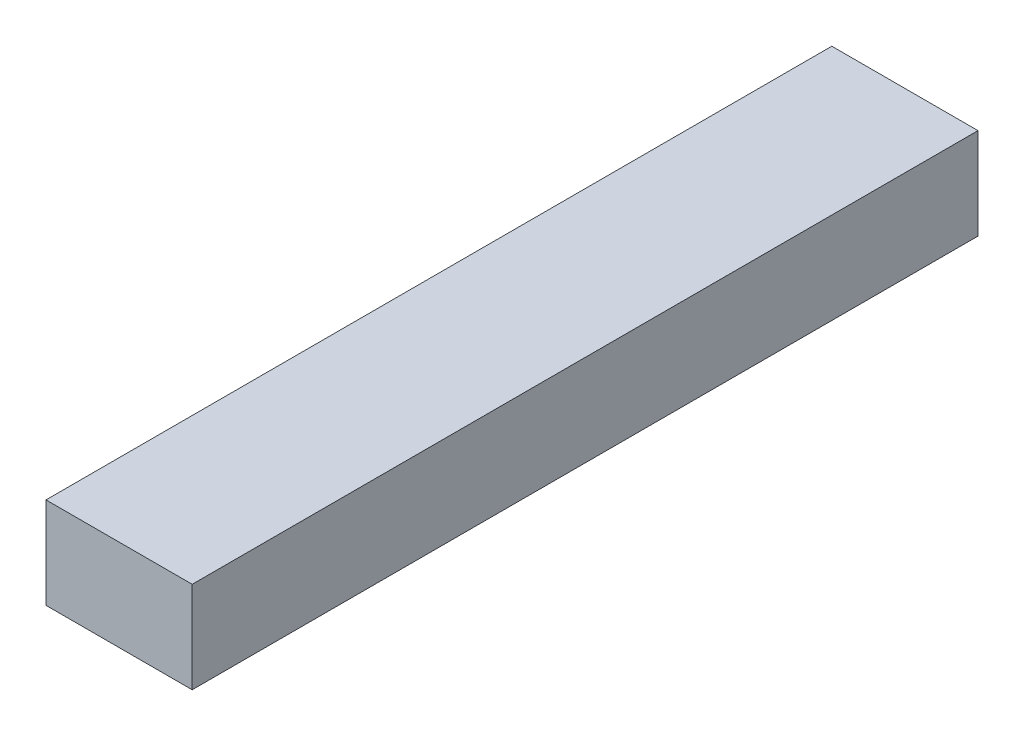
ISO-10303-21;
HEADER;
FILE_DESCRIPTION(('STEP AP214'),'2;1');
FILE_NAME('part.step','',(''),(''),'','','');
FILE_SCHEMA(('AUTOMOTIVE_DESIGN { 1 0 10303 214 1 1 1 1 }'));
ENDSEC;
DATA;
#1=APPLICATION_CONTEXT('core data for automotive mechanical design processes');
#2=APPLICATION_PROTOCOL_DEFINITION('international standard','automotive_design',2000,#1);
#3=PRODUCT_CONTEXT('',#1,'mechanical');
#4=PRODUCT('Part','Part','',(#3));
#5=PRODUCT_RELATED_PRODUCT_CATEGORY('part','',(#4));
#6=PRODUCT_DEFINITION_FORMATION('','',#4);
#7=PRODUCT_DEFINITION_CONTEXT('part definition',#1,'design');
#8=PRODUCT_DEFINITION('design','',#6,#7);
#9=PRODUCT_DEFINITION_SHAPE('','',#8);
#10=(LENGTH_UNIT() NAMED_UNIT(*) SI_UNIT(.MILLI.,.METRE.));
#11=(NAMED_UNIT(*) PLANE_ANGLE_UNIT() SI_UNIT($,.RADIAN.));
#12=(NAMED_UNIT(*) SI_UNIT($,.STERADIAN.) SOLID_ANGLE_UNIT());
#13=UNCERTAINTY_MEASURE_WITH_UNIT(LENGTH_MEASURE(1.E-05),#10,'distance_accuracy_value','');
#14=(GEOMETRIC_REPRESENTATION_CONTEXT(3) GLOBAL_UNCERTAINTY_ASSIGNED_CONTEXT((#13)) GLOBAL_UNIT_ASSIGNED_CONTEXT((#10,
#11,#12)) REPRESENTATION_CONTEXT('',''));
#15=CARTESIAN_POINT('',(0.,0.,0.));
#16=DIRECTION('',(0.,0.,1.));
#17=DIRECTION('',(1.,0.,0.));
#18=AXIS2_PLACEMENT_3D('',#15,#16,#17);
#19=CARTESIAN_POINT('',(8.,-5.,86.));
#20=DIRECTION('',(-1.,0.,0.));
#21=DIRECTION('',(0.,0.,1.));
#22=AXIS2_PLACEMENT_3D('',#19,#20,#21);
#23=PLANE('',#22);
#24=DIRECTION('',(0.,1.,0.));
#25=VECTOR('',#24,1.);
#26=CARTESIAN_POINT('',(8.,-5.,0.));
#27=LINE('',#26,#25);
#28=CARTESIAN_POINT('',(8.,-5.,0.));
#29=VERTEX_POINT('',#28);
#30=CARTESIAN_POINT('',(8.,5.,0.));
#31=VERTEX_POINT('',#30);
#32=EDGE_CURVE('E107',#29,#31,#27,.T.);
#33=ORIENTED_EDGE('',*,*,#32,.T.);
#34=DIRECTION('',(0.,0.,-1.));
#35=VECTOR('',#34,1.);
#36=CARTESIAN_POINT('',(8.,5.,86.));
#37=LINE('',#36,#35);
#38=CARTESIAN_POINT('',(8.,5.,86.));
#39=VERTEX_POINT('',#38);
#40=EDGE_CURVE('E11',#39,#31,#37,.T.);
#41=ORIENTED_EDGE('',*,*,#40,.F.);
#42=DIRECTION('',(0.,1.,0.));
#43=VECTOR('',#42,1.);
#44=CARTESIAN_POINT('',(8.,-5.,86.));
#45=LINE('',#44,#43);
#46=CARTESIAN_POINT('',(8.,-5.,86.));
#47=VERTEX_POINT('',#46);
#48=EDGE_CURVE('E91',#47,#39,#45,.T.);
#49=ORIENTED_EDGE('',*,*,#48,.F.);
#50=DIRECTION('',(0.,0.,-1.));
#51=VECTOR('',#50,1.);
#52=CARTESIAN_POINT('',(8.,-5.,86.));
#53=LINE('',#52,#51);
#54=EDGE_CURVE('E103',#47,#29,#53,.T.);
#55=ORIENTED_EDGE('',*,*,#54,.T.);
#56=EDGE_LOOP('',(#33,#41,#49,#55));
#57=FACE_BOUND('',#56,.T.);
#58=ADVANCED_FACE('F39',(#57),#23,.F.);
#59=CARTESIAN_POINT('',(-8.,5.,86.));
#60=DIRECTION('',(0.,-1.,0.));
#61=DIRECTION('',(0.,0.,-1.));
#62=AXIS2_PLACEMENT_3D('',#59,#60,#61);
#63=PLANE('',#62);
#64=DIRECTION('',(-1.,0.,0.));
#65=VECTOR('',#64,1.);
#66=CARTESIAN_POINT('',(-8.,5.,0.));
#67=LINE('',#66,#65);
#68=CARTESIAN_POINT('',(-8.,5.,0.));
#69=VERTEX_POINT('',#68);
#70=EDGE_CURVE('E96',#31,#69,#67,.T.);
#71=ORIENTED_EDGE('',*,*,#70,.T.);
#72=DIRECTION('',(0.,0.,-1.));
#73=VECTOR('',#72,1.);
#74=CARTESIAN_POINT('',(-8.,5.,86.));
#75=LINE('',#74,#73);
#76=CARTESIAN_POINT('',(-8.,5.,86.));
#77=VERTEX_POINT('',#76);
#78=EDGE_CURVE('E48',#77,#69,#75,.T.);
#79=ORIENTED_EDGE('',*,*,#78,.F.);
#80=DIRECTION('',(-1.,0.,0.));
#81=VECTOR('',#80,1.);
#82=CARTESIAN_POINT('',(-8.,5.,86.));
#83=LINE('',#82,#81);
#84=EDGE_CURVE('E86',#39,#77,#83,.T.);
#85=ORIENTED_EDGE('',*,*,#84,.F.);
#86=ORIENTED_EDGE('',*,*,#40,.T.);
#87=EDGE_LOOP('',(#71,#79,#85,#86));
#88=FACE_BOUND('',#87,.T.);
#89=ADVANCED_FACE('F95',(#88),#63,.F.);
#90=CARTESIAN_POINT('',(-8.,-5.,86.));
#91=DIRECTION('',(1.,0.,0.));
#92=DIRECTION('',(0.,0.,-1.));
#93=AXIS2_PLACEMENT_3D('',#90,#91,#92);
#94=PLANE('',#93);
#95=DIRECTION('',(0.,-1.,0.));
#96=VECTOR('',#95,1.);
#97=CARTESIAN_POINT('',(-8.,-5.,0.));
#98=LINE('',#97,#96);
#99=CARTESIAN_POINT('',(-8.,-5.,0.));
#100=VERTEX_POINT('',#99);
#101=EDGE_CURVE('E73',#69,#100,#98,.T.);
#102=ORIENTED_EDGE('',*,*,#101,.T.);
#103=DIRECTION('',(0.,0.,-1.));
#104=VECTOR('',#103,1.);
#105=CARTESIAN_POINT('',(-8.,-5.,86.));
#106=LINE('',#105,#104);
#107=CARTESIAN_POINT('',(-8.,-5.,86.));
#108=VERTEX_POINT('',#107);
#109=EDGE_CURVE('E98',#108,#100,#106,.T.);
#110=ORIENTED_EDGE('',*,*,#109,.F.);
#111=DIRECTION('',(0.,-1.,0.));
#112=VECTOR('',#111,1.);
#113=CARTESIAN_POINT('',(-8.,-5.,86.));
#114=LINE('',#113,#112);
#115=EDGE_CURVE('E89',#77,#108,#114,.T.);
#116=ORIENTED_EDGE('',*,*,#115,.F.);
#117=ORIENTED_EDGE('',*,*,#78,.T.);
#118=EDGE_LOOP('',(#102,#110,#116,#117));
#119=FACE_BOUND('',#118,.T.);
#120=ADVANCED_FACE('F99',(#119),#94,.F.);
#121=CARTESIAN_POINT('',(-8.,-5.,86.));
#122=DIRECTION('',(0.,1.,0.));
#123=DIRECTION('',(0.,0.,1.));
#124=AXIS2_PLACEMENT_3D('',#121,#122,#123);
#125=PLANE('',#124);
#126=DIRECTION('',(1.,0.,0.));
#127=VECTOR('',#126,1.);
#128=CARTESIAN_POINT('',(-8.,-5.,0.));
#129=LINE('',#128,#127);
#130=EDGE_CURVE('E79',#100,#29,#129,.T.);
#131=ORIENTED_EDGE('',*,*,#130,.T.);
#132=ORIENTED_EDGE('',*,*,#54,.F.);
#133=DIRECTION('',(1.,0.,0.));
#134=VECTOR('',#133,1.);
#135=CARTESIAN_POINT('',(-8.,-5.,86.));
#136=LINE('',#135,#134);
#137=EDGE_CURVE('E56',#108,#47,#136,.T.);
#138=ORIENTED_EDGE('',*,*,#137,.F.);
#139=ORIENTED_EDGE('',*,*,#109,.T.);
#140=EDGE_LOOP('',(#131,#132,#138,#139));
#141=FACE_BOUND('',#140,.T.);
#142=ADVANCED_FACE('F120',(#141),#125,.F.);
#143=CARTESIAN_POINT('',(0.,0.,86.));
#144=DIRECTION('',(0.,0.,-1.));
#145=DIRECTION('',(-1.,0.,0.));
#146=AXIS2_PLACEMENT_3D('',#143,#144,#145);
#147=PLANE('',#146);
#148=ORIENTED_EDGE('',*,*,#48,.T.);
#149=ORIENTED_EDGE('',*,*,#84,.T.);
#150=ORIENTED_EDGE('',*,*,#115,.T.);
#151=ORIENTED_EDGE('',*,*,#137,.T.);
#152=EDGE_LOOP('',(#148,#149,#150,#151));
#153=FACE_BOUND('',#152,.T.);
#154=ADVANCED_FACE('F87',(#153),#147,.F.);
#155=CARTESIAN_POINT('',(0.,0.,0.));
#156=DIRECTION('',(0.,0.,-1.));
#157=DIRECTION('',(-1.,0.,0.));
#158=AXIS2_PLACEMENT_3D('',#155,#156,#157);
#159=PLANE('',#158);
#160=ORIENTED_EDGE('',*,*,#32,.F.);
#161=ORIENTED_EDGE('',*,*,#130,.F.);
#162=ORIENTED_EDGE('',*,*,#101,.F.);
#163=ORIENTED_EDGE('',*,*,#70,.F.);
#164=EDGE_LOOP('',(#160,#161,#162,#163));
#165=FACE_BOUND('',#164,.T.);
#166=ADVANCED_FACE('F123',(#165),#159,.T.);
#167=CLOSED_SHELL('',(#58,#89,#120,#142,#154,#166));
#168=MANIFOLD_SOLID_BREP('B2',#167);
#169=ADVANCED_BREP_SHAPE_REPRESENTATION('',(#18,#168),#14);
#170=SHAPE_DEFINITION_REPRESENTATION(#9,#169);
ENDSEC;
END-ISO-10303-21;
